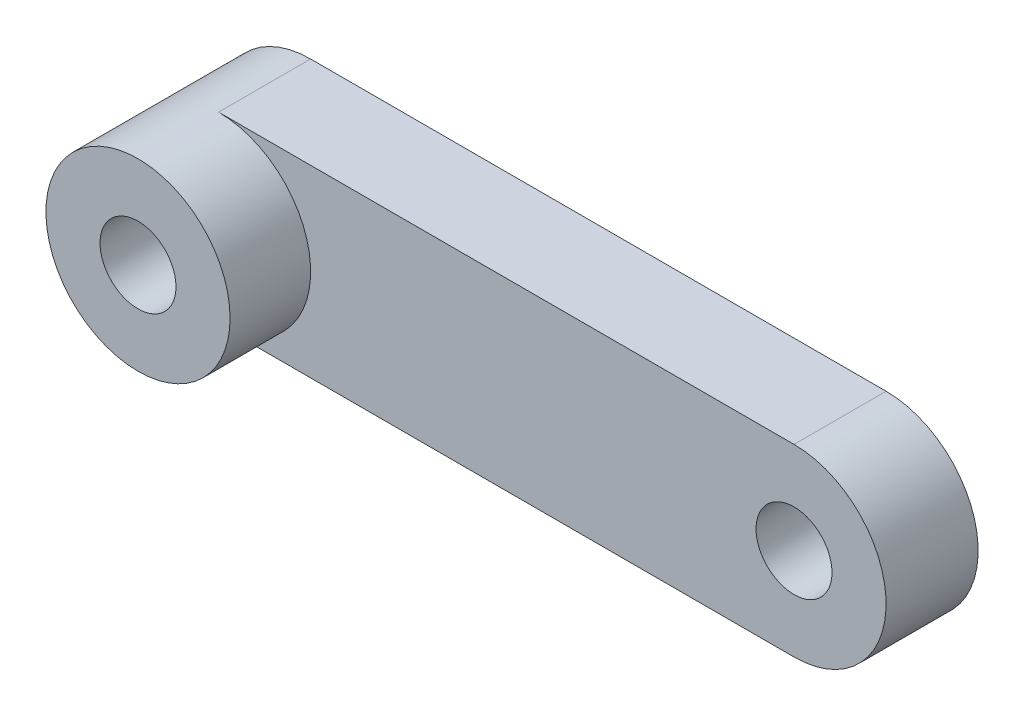
ISO-10303-21;
HEADER;
FILE_DESCRIPTION(('STEP AP214'),'2;1');
FILE_NAME('part.step','',(''),(''),'','','');
FILE_SCHEMA(('AUTOMOTIVE_DESIGN { 1 0 10303 214 1 1 1 1 }'));
ENDSEC;
DATA;
#1=APPLICATION_CONTEXT('core data for automotive mechanical design processes');
#2=APPLICATION_PROTOCOL_DEFINITION('international standard','automotive_design',2000,#1);
#3=PRODUCT_CONTEXT('',#1,'mechanical');
#4=PRODUCT('Part','Part','',(#3));
#5=PRODUCT_RELATED_PRODUCT_CATEGORY('part','',(#4));
#6=PRODUCT_DEFINITION_FORMATION('','',#4);
#7=PRODUCT_DEFINITION_CONTEXT('part definition',#1,'design');
#8=PRODUCT_DEFINITION('design','',#6,#7);
#9=PRODUCT_DEFINITION_SHAPE('','',#8);
#10=(LENGTH_UNIT() NAMED_UNIT(*) SI_UNIT(.MILLI.,.METRE.));
#11=(NAMED_UNIT(*) PLANE_ANGLE_UNIT() SI_UNIT($,.RADIAN.));
#12=(NAMED_UNIT(*) SI_UNIT($,.STERADIAN.) SOLID_ANGLE_UNIT());
#13=UNCERTAINTY_MEASURE_WITH_UNIT(LENGTH_MEASURE(1.E-05),#10,'distance_accuracy_value','');
#14=(GEOMETRIC_REPRESENTATION_CONTEXT(3) GLOBAL_UNCERTAINTY_ASSIGNED_CONTEXT((#13)) GLOBAL_UNIT_ASSIGNED_CONTEXT((#10,
#11,#12)) REPRESENTATION_CONTEXT('',''));
#15=CARTESIAN_POINT('',(0.,0.,0.));
#16=DIRECTION('',(0.,0.,1.));
#17=DIRECTION('',(1.,0.,0.));
#18=AXIS2_PLACEMENT_3D('',#15,#16,#17);
#19=CARTESIAN_POINT('',(-25.,0.,4.));
#20=DIRECTION('',(0.,0.,1.));
#21=DIRECTION('',(1.,0.,0.));
#22=AXIS2_PLACEMENT_3D('',#19,#20,#21);
#23=PLANE('',#22);
#24=CARTESIAN_POINT('',(-25.,0.,4.));
#25=DIRECTION('',(0.,0.,1.));
#26=DIRECTION('',(1.,0.,0.));
#27=AXIS2_PLACEMENT_3D('',#24,#25,#26);
#28=CIRCLE('',#27,4.);
#29=CARTESIAN_POINT('',(-25.,-4.,4.));
#30=VERTEX_POINT('',#29);
#31=CARTESIAN_POINT('',(-25.,4.,4.));
#32=VERTEX_POINT('',#31);
#33=EDGE_CURVE('E11',#30,#32,#28,.T.);
#34=ORIENTED_EDGE('',*,*,#33,.F.);
#35=DIRECTION('',(1.,0.,0.));
#36=VECTOR('',#35,1.);
#37=CARTESIAN_POINT('',(-25.,-4.,4.));
#38=LINE('',#37,#36);
#39=CARTESIAN_POINT('',(0.,-4.,4.));
#40=VERTEX_POINT('',#39);
#41=EDGE_CURVE('E120',#30,#40,#38,.T.);
#42=ORIENTED_EDGE('',*,*,#41,.T.);
#43=CARTESIAN_POINT('',(0.,0.,4.));
#44=DIRECTION('',(0.,0.,1.));
#45=DIRECTION('',(1.,0.,0.));
#46=AXIS2_PLACEMENT_3D('',#43,#44,#45);
#47=CIRCLE('',#46,4.);
#48=CARTESIAN_POINT('',(0.,4.,4.));
#49=VERTEX_POINT('',#48);
#50=EDGE_CURVE('E62',#40,#49,#47,.T.);
#51=ORIENTED_EDGE('',*,*,#50,.T.);
#52=DIRECTION('',(-1.,0.,0.));
#53=VECTOR('',#52,1.);
#54=CARTESIAN_POINT('',(-25.,4.,4.));
#55=LINE('',#54,#53);
#56=EDGE_CURVE('E93',#49,#32,#55,.T.);
#57=ORIENTED_EDGE('',*,*,#56,.T.);
#58=EDGE_LOOP('',(#34,#42,#51,#57));
#59=FACE_BOUND('',#58,.T.);
#60=CARTESIAN_POINT('',(0.,0.,4.));
#61=DIRECTION('',(0.,0.,1.));
#62=DIRECTION('',(1.,0.,0.));
#63=AXIS2_PLACEMENT_3D('',#60,#61,#62);
#64=CIRCLE('',#63,1.65);
#65=CARTESIAN_POINT('',(1.65,0.,4.));
#66=VERTEX_POINT('',#65);
#67=EDGE_CURVE('E126',#66,#66,#64,.T.);
#68=ORIENTED_EDGE('',*,*,#67,.F.);
#69=EDGE_LOOP('',(#68));
#70=FACE_BOUND('',#69,.T.);
#71=ADVANCED_FACE('F43',(#59,#70),#23,.T.);
#72=CARTESIAN_POINT('',(-25.,0.,0.));
#73=DIRECTION('',(0.,0.,1.));
#74=DIRECTION('',(1.,0.,0.));
#75=AXIS2_PLACEMENT_3D('',#72,#73,#74);
#76=PLANE('',#75);
#77=CARTESIAN_POINT('',(-25.,0.,0.));
#78=DIRECTION('',(0.,0.,1.));
#79=DIRECTION('',(1.,0.,0.));
#80=AXIS2_PLACEMENT_3D('',#77,#78,#79);
#81=CIRCLE('',#80,4.);
#82=CARTESIAN_POINT('',(-25.,4.,0.));
#83=VERTEX_POINT('',#82);
#84=CARTESIAN_POINT('',(-25.,-4.,0.));
#85=VERTEX_POINT('',#84);
#86=EDGE_CURVE('E106',#83,#85,#81,.T.);
#87=ORIENTED_EDGE('',*,*,#86,.F.);
#88=DIRECTION('',(-1.,0.,0.));
#89=VECTOR('',#88,1.);
#90=CARTESIAN_POINT('',(-25.,4.,0.));
#91=LINE('',#90,#89);
#92=CARTESIAN_POINT('',(0.,4.,0.));
#93=VERTEX_POINT('',#92);
#94=EDGE_CURVE('E85',#93,#83,#91,.T.);
#95=ORIENTED_EDGE('',*,*,#94,.F.);
#96=CARTESIAN_POINT('',(0.,0.,0.));
#97=DIRECTION('',(0.,0.,1.));
#98=DIRECTION('',(1.,0.,0.));
#99=AXIS2_PLACEMENT_3D('',#96,#97,#98);
#100=CIRCLE('',#99,4.);
#101=CARTESIAN_POINT('',(0.,-4.,0.));
#102=VERTEX_POINT('',#101);
#103=EDGE_CURVE('E79',#102,#93,#100,.T.);
#104=ORIENTED_EDGE('',*,*,#103,.F.);
#105=DIRECTION('',(1.,0.,0.));
#106=VECTOR('',#105,1.);
#107=CARTESIAN_POINT('',(-25.,-4.,0.));
#108=LINE('',#107,#106);
#109=EDGE_CURVE('E123',#85,#102,#108,.T.);
#110=ORIENTED_EDGE('',*,*,#109,.F.);
#111=EDGE_LOOP('',(#87,#95,#104,#110));
#112=FACE_BOUND('',#111,.T.);
#113=CARTESIAN_POINT('',(0.,0.,0.));
#114=DIRECTION('',(0.,0.,1.));
#115=DIRECTION('',(1.,0.,0.));
#116=AXIS2_PLACEMENT_3D('',#113,#114,#115);
#117=CIRCLE('',#116,1.65);
#118=CARTESIAN_POINT('',(1.65,0.,0.));
#119=VERTEX_POINT('',#118);
#120=EDGE_CURVE('E131',#119,#119,#117,.T.);
#121=ORIENTED_EDGE('',*,*,#120,.T.);
#122=EDGE_LOOP('',(#121));
#123=FACE_BOUND('',#122,.T.);
#124=CARTESIAN_POINT('',(-25.,0.,0.));
#125=DIRECTION('',(0.,0.,1.));
#126=DIRECTION('',(1.,0.,0.));
#127=AXIS2_PLACEMENT_3D('',#124,#125,#126);
#128=CIRCLE('',#127,1.65);
#129=CARTESIAN_POINT('',(-23.35,0.,0.));
#130=VERTEX_POINT('',#129);
#131=EDGE_CURVE('E135',#130,#130,#128,.T.);
#132=ORIENTED_EDGE('',*,*,#131,.T.);
#133=EDGE_LOOP('',(#132));
#134=FACE_BOUND('',#133,.T.);
#135=ADVANCED_FACE('F163',(#112,#123,#134),#76,.F.);
#136=CARTESIAN_POINT('',(-25.,0.,4.));
#137=DIRECTION('',(0.,0.,-1.));
#138=DIRECTION('',(-1.,0.,0.));
#139=AXIS2_PLACEMENT_3D('',#136,#137,#138);
#140=CYLINDRICAL_SURFACE('',#139,4.);
#141=ORIENTED_EDGE('',*,*,#86,.T.);
#142=DIRECTION('',(0.,0.,-1.));
#143=VECTOR('',#142,1.);
#144=CARTESIAN_POINT('',(-25.,-4.,4.));
#145=LINE('',#144,#143);
#146=EDGE_CURVE('E47',#30,#85,#145,.T.);
#147=ORIENTED_EDGE('',*,*,#146,.F.);
#148=ORIENTED_EDGE('',*,*,#33,.T.);
#149=DIRECTION('',(0.,0.,-1.));
#150=VECTOR('',#149,1.);
#151=CARTESIAN_POINT('',(-25.,4.,4.));
#152=LINE('',#151,#150);
#153=EDGE_CURVE('E91',#32,#83,#152,.T.);
#154=ORIENTED_EDGE('',*,*,#153,.T.);
#155=EDGE_LOOP('',(#141,#147,#148,#154));
#156=FACE_BOUND('',#155,.T.);
#157=CARTESIAN_POINT('',(-25.,0.,7.5));
#158=DIRECTION('',(0.,0.,1.));
#159=DIRECTION('',(1.,0.,0.));
#160=AXIS2_PLACEMENT_3D('',#157,#158,#159);
#161=CIRCLE('',#160,4.);
#162=CARTESIAN_POINT('',(-21.,0.,7.5));
#163=VERTEX_POINT('',#162);
#164=EDGE_CURVE('E140',#163,#163,#161,.T.);
#165=ORIENTED_EDGE('',*,*,#164,.F.);
#166=EDGE_LOOP('',(#165));
#167=FACE_BOUND('',#166,.T.);
#168=ADVANCED_FACE('F45',(#156,#167),#140,.T.);
#169=CARTESIAN_POINT('',(-25.,-4.,4.));
#170=DIRECTION('',(0.,1.,0.));
#171=DIRECTION('',(0.,0.,1.));
#172=AXIS2_PLACEMENT_3D('',#169,#170,#171);
#173=PLANE('',#172);
#174=ORIENTED_EDGE('',*,*,#109,.T.);
#175=DIRECTION('',(0.,0.,-1.));
#176=VECTOR('',#175,1.);
#177=CARTESIAN_POINT('',(0.,-4.,4.));
#178=LINE('',#177,#176);
#179=EDGE_CURVE('E109',#40,#102,#178,.T.);
#180=ORIENTED_EDGE('',*,*,#179,.F.);
#181=ORIENTED_EDGE('',*,*,#41,.F.);
#182=ORIENTED_EDGE('',*,*,#146,.T.);
#183=EDGE_LOOP('',(#174,#180,#181,#182));
#184=FACE_BOUND('',#183,.T.);
#185=ADVANCED_FACE('F176',(#184),#173,.F.);
#186=CARTESIAN_POINT('',(0.,0.,4.));
#187=DIRECTION('',(0.,0.,-1.));
#188=DIRECTION('',(-1.,0.,0.));
#189=AXIS2_PLACEMENT_3D('',#186,#187,#188);
#190=CYLINDRICAL_SURFACE('',#189,4.);
#191=ORIENTED_EDGE('',*,*,#103,.T.);
#192=DIRECTION('',(0.,0.,-1.));
#193=VECTOR('',#192,1.);
#194=CARTESIAN_POINT('',(0.,4.,4.));
#195=LINE('',#194,#193);
#196=EDGE_CURVE('E98',#49,#93,#195,.T.);
#197=ORIENTED_EDGE('',*,*,#196,.F.);
#198=ORIENTED_EDGE('',*,*,#50,.F.);
#199=ORIENTED_EDGE('',*,*,#179,.T.);
#200=EDGE_LOOP('',(#191,#197,#198,#199));
#201=FACE_BOUND('',#200,.T.);
#202=ADVANCED_FACE('F174',(#201),#190,.T.);
#203=CARTESIAN_POINT('',(-25.,4.,4.));
#204=DIRECTION('',(0.,-1.,0.));
#205=DIRECTION('',(0.,0.,-1.));
#206=AXIS2_PLACEMENT_3D('',#203,#204,#205);
#207=PLANE('',#206);
#208=ORIENTED_EDGE('',*,*,#94,.T.);
#209=ORIENTED_EDGE('',*,*,#153,.F.);
#210=ORIENTED_EDGE('',*,*,#56,.F.);
#211=ORIENTED_EDGE('',*,*,#196,.T.);
#212=EDGE_LOOP('',(#208,#209,#210,#211));
#213=FACE_BOUND('',#212,.T.);
#214=ADVANCED_FACE('F92',(#213),#207,.F.);
#215=CARTESIAN_POINT('',(0.,0.,4.));
#216=DIRECTION('',(0.,0.,-1.));
#217=DIRECTION('',(-1.,0.,0.));
#218=AXIS2_PLACEMENT_3D('',#215,#216,#217);
#219=CYLINDRICAL_SURFACE('',#218,1.65);
#220=ORIENTED_EDGE('',*,*,#67,.T.);
#221=EDGE_LOOP('',(#220));
#222=FACE_BOUND('',#221,.T.);
#223=ORIENTED_EDGE('',*,*,#120,.F.);
#224=EDGE_LOOP('',(#223));
#225=FACE_BOUND('',#224,.T.);
#226=ADVANCED_FACE('F159',(#222,#225),#219,.F.);
#227=CARTESIAN_POINT('',(-25.,0.,4.));
#228=DIRECTION('',(0.,0.,-1.));
#229=DIRECTION('',(-1.,0.,0.));
#230=AXIS2_PLACEMENT_3D('',#227,#228,#229);
#231=CYLINDRICAL_SURFACE('',#230,1.65);
#232=ORIENTED_EDGE('',*,*,#131,.F.);
#233=EDGE_LOOP('',(#232));
#234=FACE_BOUND('',#233,.T.);
#235=CARTESIAN_POINT('',(-25.,0.,7.5));
#236=DIRECTION('',(0.,0.,1.));
#237=DIRECTION('',(1.,0.,0.));
#238=AXIS2_PLACEMENT_3D('',#235,#236,#237);
#239=CIRCLE('',#238,1.65);
#240=CARTESIAN_POINT('',(-23.35,0.,7.5));
#241=VERTEX_POINT('',#240);
#242=EDGE_CURVE('E145',#241,#241,#239,.T.);
#243=ORIENTED_EDGE('',*,*,#242,.T.);
#244=EDGE_LOOP('',(#243));
#245=FACE_BOUND('',#244,.T.);
#246=ADVANCED_FACE('F150',(#234,#245),#231,.F.);
#247=CARTESIAN_POINT('',(-25.,0.,7.5));
#248=DIRECTION('',(0.,0.,1.));
#249=DIRECTION('',(1.,0.,0.));
#250=AXIS2_PLACEMENT_3D('',#247,#248,#249);
#251=PLANE('',#250);
#252=ORIENTED_EDGE('',*,*,#164,.T.);
#253=EDGE_LOOP('',(#252));
#254=FACE_BOUND('',#253,.T.);
#255=ORIENTED_EDGE('',*,*,#242,.F.);
#256=EDGE_LOOP('',(#255));
#257=FACE_BOUND('',#256,.T.);
#258=ADVANCED_FACE('F152',(#254,#257),#251,.T.);
#259=CLOSED_SHELL('',(#71,#135,#168,#185,#202,#214,#226,#246,#258));
#260=MANIFOLD_SOLID_BREP('B2',#259);
#261=ADVANCED_BREP_SHAPE_REPRESENTATION('',(#18,#260),#14);
#262=SHAPE_DEFINITION_REPRESENTATION(#9,#261);
ENDSEC;
END-ISO-10303-21;
